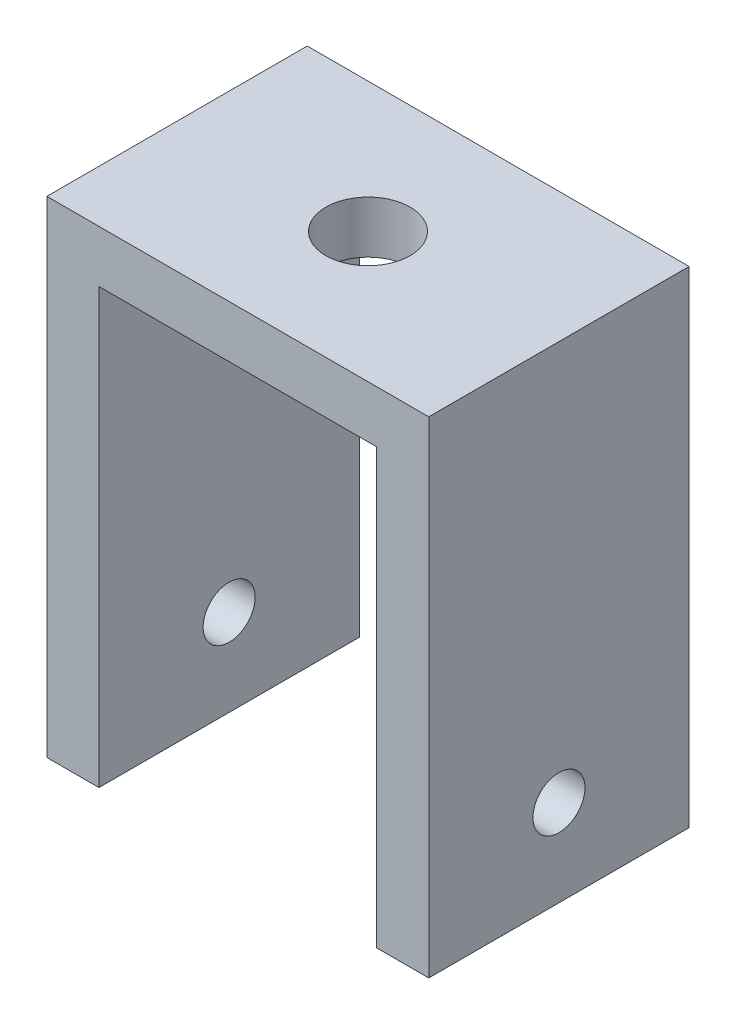
ISO-10303-21;
HEADER;
FILE_DESCRIPTION(('STEP AP214'),'2;1');
FILE_NAME('part.step','',(''),(''),'','','');
FILE_SCHEMA(('AUTOMOTIVE_DESIGN { 1 0 10303 214 1 1 1 1 }'));
ENDSEC;
DATA;
#1=APPLICATION_CONTEXT('core data for automotive mechanical design processes');
#2=APPLICATION_PROTOCOL_DEFINITION('international standard','automotive_design',2000,#1);
#3=PRODUCT_CONTEXT('',#1,'mechanical');
#4=PRODUCT('Part','Part','',(#3));
#5=PRODUCT_RELATED_PRODUCT_CATEGORY('part','',(#4));
#6=PRODUCT_DEFINITION_FORMATION('','',#4);
#7=PRODUCT_DEFINITION_CONTEXT('part definition',#1,'design');
#8=PRODUCT_DEFINITION('design','',#6,#7);
#9=PRODUCT_DEFINITION_SHAPE('','',#8);
#10=(LENGTH_UNIT() NAMED_UNIT(*) SI_UNIT(.MILLI.,.METRE.));
#11=(NAMED_UNIT(*) PLANE_ANGLE_UNIT() SI_UNIT($,.RADIAN.));
#12=(NAMED_UNIT(*) SI_UNIT($,.STERADIAN.) SOLID_ANGLE_UNIT());
#13=UNCERTAINTY_MEASURE_WITH_UNIT(LENGTH_MEASURE(1.E-05),#10,'distance_accuracy_value','');
#14=(GEOMETRIC_REPRESENTATION_CONTEXT(3) GLOBAL_UNCERTAINTY_ASSIGNED_CONTEXT((#13)) GLOBAL_UNIT_ASSIGNED_CONTEXT((#10,
#11,#12)) REPRESENTATION_CONTEXT('',''));
#15=CARTESIAN_POINT('',(0.,0.,0.));
#16=DIRECTION('',(0.,0.,1.));
#17=DIRECTION('',(1.,0.,0.));
#18=AXIS2_PLACEMENT_3D('',#15,#16,#17);
#19=CARTESIAN_POINT('',(0.,0.,15.));
#20=DIRECTION('',(0.,1.,0.));
#21=DIRECTION('',(0.,0.,1.));
#22=AXIS2_PLACEMENT_3D('',#19,#20,#21);
#23=PLANE('',#22);
#24=CARTESIAN_POINT('',(0.,0.,7.5));
#25=DIRECTION('',(0.,1.,0.));
#26=DIRECTION('',(0.,0.,1.));
#27=AXIS2_PLACEMENT_3D('',#24,#25,#26);
#28=CIRCLE('',#27,2.425);
#29=CARTESIAN_POINT('',(0.,0.,9.925));
#30=VERTEX_POINT('',#29);
#31=EDGE_CURVE('E218',#30,#30,#28,.T.);
#32=ORIENTED_EDGE('',*,*,#31,.T.);
#33=EDGE_LOOP('',(#32));
#34=FACE_BOUND('',#33,.T.);
#35=DIRECTION('',(1.,0.,0.));
#36=VECTOR('',#35,1.);
#37=CARTESIAN_POINT('',(0.,0.,0.));
#38=LINE('',#37,#36);
#39=CARTESIAN_POINT('',(-8.,0.,0.));
#40=VERTEX_POINT('',#39);
#41=CARTESIAN_POINT('',(8.,0.,0.));
#42=VERTEX_POINT('',#41);
#43=EDGE_CURVE('E93',#40,#42,#38,.T.);
#44=ORIENTED_EDGE('',*,*,#43,.T.);
#45=DIRECTION('',(0.,0.,-1.));
#46=VECTOR('',#45,1.);
#47=CARTESIAN_POINT('',(8.,0.,15.));
#48=LINE('',#47,#46);
#49=CARTESIAN_POINT('',(8.,0.,15.));
#50=VERTEX_POINT('',#49);
#51=EDGE_CURVE('E11',#50,#42,#48,.T.);
#52=ORIENTED_EDGE('',*,*,#51,.F.);
#53=DIRECTION('',(1.,0.,0.));
#54=VECTOR('',#53,1.);
#55=CARTESIAN_POINT('',(0.,0.,15.));
#56=LINE('',#55,#54);
#57=CARTESIAN_POINT('',(-8.,0.,15.));
#58=VERTEX_POINT('',#57);
#59=EDGE_CURVE('E99',#58,#50,#56,.T.);
#60=ORIENTED_EDGE('',*,*,#59,.F.);
#61=DIRECTION('',(0.,0.,-1.));
#62=VECTOR('',#61,1.);
#63=CARTESIAN_POINT('',(-8.,0.,15.));
#64=LINE('',#63,#62);
#65=EDGE_CURVE('E137',#58,#40,#64,.T.);
#66=ORIENTED_EDGE('',*,*,#65,.T.);
#67=EDGE_LOOP('',(#44,#52,#60,#66));
#68=FACE_BOUND('',#67,.T.);
#69=ADVANCED_FACE('F39',(#34,#68),#23,.F.);
#70=CARTESIAN_POINT('',(8.,0.,15.));
#71=DIRECTION('',(1.,0.,0.));
#72=DIRECTION('',(0.,1.,0.));
#73=AXIS2_PLACEMENT_3D('',#70,#71,#72);
#74=PLANE('',#73);
#75=CARTESIAN_POINT('',(8.,-20.,7.5));
#76=DIRECTION('',(1.,0.,0.));
#77=DIRECTION('',(0.,1.,0.));
#78=AXIS2_PLACEMENT_3D('',#75,#76,#77);
#79=CIRCLE('',#78,1.5);
#80=CARTESIAN_POINT('',(8.,-18.5,7.5));
#81=VERTEX_POINT('',#80);
#82=EDGE_CURVE('E144',#81,#81,#79,.T.);
#83=ORIENTED_EDGE('',*,*,#82,.T.);
#84=EDGE_LOOP('',(#83));
#85=FACE_BOUND('',#84,.T.);
#86=DIRECTION('',(0.,-1.,0.));
#87=VECTOR('',#86,1.);
#88=CARTESIAN_POINT('',(8.,0.,0.));
#89=LINE('',#88,#87);
#90=CARTESIAN_POINT('',(8.,-25.,0.));
#91=VERTEX_POINT('',#90);
#92=EDGE_CURVE('E143',#42,#91,#89,.T.);
#93=ORIENTED_EDGE('',*,*,#92,.T.);
#94=DIRECTION('',(0.,0.,-1.));
#95=VECTOR('',#94,1.);
#96=CARTESIAN_POINT('',(8.,-25.,15.));
#97=LINE('',#96,#95);
#98=CARTESIAN_POINT('',(8.,-25.,15.));
#99=VERTEX_POINT('',#98);
#100=EDGE_CURVE('E49',#99,#91,#97,.T.);
#101=ORIENTED_EDGE('',*,*,#100,.F.);
#102=DIRECTION('',(0.,-1.,0.));
#103=VECTOR('',#102,1.);
#104=CARTESIAN_POINT('',(8.,0.,15.));
#105=LINE('',#104,#103);
#106=EDGE_CURVE('E205',#50,#99,#105,.T.);
#107=ORIENTED_EDGE('',*,*,#106,.F.);
#108=ORIENTED_EDGE('',*,*,#51,.T.);
#109=EDGE_LOOP('',(#93,#101,#107,#108));
#110=FACE_BOUND('',#109,.T.);
#111=ADVANCED_FACE('F244',(#85,#110),#74,.F.);
#112=CARTESIAN_POINT('',(8.,-25.,15.));
#113=DIRECTION('',(0.,1.,0.));
#114=DIRECTION('',(0.,0.,1.));
#115=AXIS2_PLACEMENT_3D('',#112,#113,#114);
#116=PLANE('',#115);
#117=DIRECTION('',(1.,0.,0.));
#118=VECTOR('',#117,1.);
#119=CARTESIAN_POINT('',(8.,-25.,0.));
#120=LINE('',#119,#118);
#121=CARTESIAN_POINT('',(11.,-25.,0.));
#122=VERTEX_POINT('',#121);
#123=EDGE_CURVE('E147',#91,#122,#120,.T.);
#124=ORIENTED_EDGE('',*,*,#123,.T.);
#125=DIRECTION('',(0.,0.,-1.));
#126=VECTOR('',#125,1.);
#127=CARTESIAN_POINT('',(11.,-25.,15.));
#128=LINE('',#127,#126);
#129=CARTESIAN_POINT('',(11.,-25.,15.));
#130=VERTEX_POINT('',#129);
#131=EDGE_CURVE('E175',#130,#122,#128,.T.);
#132=ORIENTED_EDGE('',*,*,#131,.F.);
#133=DIRECTION('',(1.,0.,0.));
#134=VECTOR('',#133,1.);
#135=CARTESIAN_POINT('',(8.,-25.,15.));
#136=LINE('',#135,#134);
#137=EDGE_CURVE('E187',#99,#130,#136,.T.);
#138=ORIENTED_EDGE('',*,*,#137,.F.);
#139=ORIENTED_EDGE('',*,*,#100,.T.);
#140=EDGE_LOOP('',(#124,#132,#138,#139));
#141=FACE_BOUND('',#140,.T.);
#142=ADVANCED_FACE('F185',(#141),#116,.F.);
#143=CARTESIAN_POINT('',(11.,3.,15.));
#144=DIRECTION('',(-1.,0.,0.));
#145=DIRECTION('',(0.,0.,1.));
#146=AXIS2_PLACEMENT_3D('',#143,#144,#145);
#147=PLANE('',#146);
#148=CARTESIAN_POINT('',(11.,-20.,7.5));
#149=DIRECTION('',(1.,0.,0.));
#150=DIRECTION('',(0.,0.,-1.));
#151=AXIS2_PLACEMENT_3D('',#148,#149,#150);
#152=CIRCLE('',#151,1.5);
#153=CARTESIAN_POINT('',(11.,-20.,6.));
#154=VERTEX_POINT('',#153);
#155=EDGE_CURVE('E213',#154,#154,#152,.T.);
#156=ORIENTED_EDGE('',*,*,#155,.F.);
#157=EDGE_LOOP('',(#156));
#158=FACE_BOUND('',#157,.T.);
#159=DIRECTION('',(0.,1.,0.));
#160=VECTOR('',#159,1.);
#161=CARTESIAN_POINT('',(11.,3.,0.));
#162=LINE('',#161,#160);
#163=CARTESIAN_POINT('',(11.,3.,0.));
#164=VERTEX_POINT('',#163);
#165=EDGE_CURVE('E150',#122,#164,#162,.T.);
#166=ORIENTED_EDGE('',*,*,#165,.T.);
#167=DIRECTION('',(0.,0.,-1.));
#168=VECTOR('',#167,1.);
#169=CARTESIAN_POINT('',(11.,3.,15.));
#170=LINE('',#169,#168);
#171=CARTESIAN_POINT('',(11.,3.,15.));
#172=VERTEX_POINT('',#171);
#173=EDGE_CURVE('E171',#172,#164,#170,.T.);
#174=ORIENTED_EDGE('',*,*,#173,.F.);
#175=DIRECTION('',(0.,1.,0.));
#176=VECTOR('',#175,1.);
#177=CARTESIAN_POINT('',(11.,3.,15.));
#178=LINE('',#177,#176);
#179=EDGE_CURVE('E199',#130,#172,#178,.T.);
#180=ORIENTED_EDGE('',*,*,#179,.F.);
#181=ORIENTED_EDGE('',*,*,#131,.T.);
#182=EDGE_LOOP('',(#166,#174,#180,#181));
#183=FACE_BOUND('',#182,.T.);
#184=ADVANCED_FACE('F194',(#158,#183),#147,.F.);
#185=CARTESIAN_POINT('',(0.,3.,15.));
#186=DIRECTION('',(0.,-1.,0.));
#187=DIRECTION('',(0.,0.,-1.));
#188=AXIS2_PLACEMENT_3D('',#185,#186,#187);
#189=PLANE('',#188);
#190=CARTESIAN_POINT('',(0.,3.,7.5));
#191=DIRECTION('',(0.,1.,0.));
#192=DIRECTION('',(0.,0.,1.));
#193=AXIS2_PLACEMENT_3D('',#190,#191,#192);
#194=CIRCLE('',#193,2.425);
#195=CARTESIAN_POINT('',(0.,3.,9.925));
#196=VERTEX_POINT('',#195);
#197=EDGE_CURVE('E225',#196,#196,#194,.T.);
#198=ORIENTED_EDGE('',*,*,#197,.F.);
#199=EDGE_LOOP('',(#198));
#200=FACE_BOUND('',#199,.T.);
#201=DIRECTION('',(-1.,0.,0.));
#202=VECTOR('',#201,1.);
#203=CARTESIAN_POINT('',(0.,3.,0.));
#204=LINE('',#203,#202);
#205=CARTESIAN_POINT('',(-11.,3.,0.));
#206=VERTEX_POINT('',#205);
#207=EDGE_CURVE('E154',#164,#206,#204,.T.);
#208=ORIENTED_EDGE('',*,*,#207,.T.);
#209=DIRECTION('',(0.,0.,-1.));
#210=VECTOR('',#209,1.);
#211=CARTESIAN_POINT('',(-11.,3.,15.));
#212=LINE('',#211,#210);
#213=CARTESIAN_POINT('',(-11.,3.,15.));
#214=VERTEX_POINT('',#213);
#215=EDGE_CURVE('E130',#214,#206,#212,.T.);
#216=ORIENTED_EDGE('',*,*,#215,.F.);
#217=DIRECTION('',(-1.,0.,0.));
#218=VECTOR('',#217,1.);
#219=CARTESIAN_POINT('',(0.,3.,15.));
#220=LINE('',#219,#218);
#221=EDGE_CURVE('E119',#172,#214,#220,.T.);
#222=ORIENTED_EDGE('',*,*,#221,.F.);
#223=ORIENTED_EDGE('',*,*,#173,.T.);
#224=EDGE_LOOP('',(#208,#216,#222,#223));
#225=FACE_BOUND('',#224,.T.);
#226=ADVANCED_FACE('F197',(#200,#225),#189,.F.);
#227=CARTESIAN_POINT('',(-11.,3.,15.));
#228=DIRECTION('',(1.,0.,0.));
#229=DIRECTION('',(0.,1.,0.));
#230=AXIS2_PLACEMENT_3D('',#227,#228,#229);
#231=PLANE('',#230);
#232=CARTESIAN_POINT('',(-11.,-20.,7.5));
#233=DIRECTION('',(1.,0.,0.));
#234=DIRECTION('',(0.,0.,-1.));
#235=AXIS2_PLACEMENT_3D('',#232,#233,#234);
#236=CIRCLE('',#235,1.5);
#237=CARTESIAN_POINT('',(-11.,-20.,6.));
#238=VERTEX_POINT('',#237);
#239=EDGE_CURVE('E217',#238,#238,#236,.T.);
#240=ORIENTED_EDGE('',*,*,#239,.T.);
#241=EDGE_LOOP('',(#240));
#242=FACE_BOUND('',#241,.T.);
#243=DIRECTION('',(0.,-1.,0.));
#244=VECTOR('',#243,1.);
#245=CARTESIAN_POINT('',(-11.,3.,0.));
#246=LINE('',#245,#244);
#247=CARTESIAN_POINT('',(-11.,-25.,0.));
#248=VERTEX_POINT('',#247);
#249=EDGE_CURVE('E128',#206,#248,#246,.T.);
#250=ORIENTED_EDGE('',*,*,#249,.T.);
#251=DIRECTION('',(0.,0.,-1.));
#252=VECTOR('',#251,1.);
#253=CARTESIAN_POINT('',(-11.,-25.,15.));
#254=LINE('',#253,#252);
#255=CARTESIAN_POINT('',(-11.,-25.,15.));
#256=VERTEX_POINT('',#255);
#257=EDGE_CURVE('E125',#256,#248,#254,.T.);
#258=ORIENTED_EDGE('',*,*,#257,.F.);
#259=DIRECTION('',(0.,-1.,0.));
#260=VECTOR('',#259,1.);
#261=CARTESIAN_POINT('',(-11.,3.,15.));
#262=LINE('',#261,#260);
#263=EDGE_CURVE('E113',#214,#256,#262,.T.);
#264=ORIENTED_EDGE('',*,*,#263,.F.);
#265=ORIENTED_EDGE('',*,*,#215,.T.);
#266=EDGE_LOOP('',(#250,#258,#264,#265));
#267=FACE_BOUND('',#266,.T.);
#268=ADVANCED_FACE('F126',(#242,#267),#231,.F.);
#269=CARTESIAN_POINT('',(-8.,-25.,15.));
#270=DIRECTION('',(0.,1.,0.));
#271=DIRECTION('',(0.,0.,1.));
#272=AXIS2_PLACEMENT_3D('',#269,#270,#271);
#273=PLANE('',#272);
#274=DIRECTION('',(1.,0.,0.));
#275=VECTOR('',#274,1.);
#276=CARTESIAN_POINT('',(-8.,-25.,0.));
#277=LINE('',#276,#275);
#278=CARTESIAN_POINT('',(-8.,-25.,0.));
#279=VERTEX_POINT('',#278);
#280=EDGE_CURVE('E86',#248,#279,#277,.T.);
#281=ORIENTED_EDGE('',*,*,#280,.T.);
#282=DIRECTION('',(0.,0.,-1.));
#283=VECTOR('',#282,1.);
#284=CARTESIAN_POINT('',(-8.,-25.,15.));
#285=LINE('',#284,#283);
#286=CARTESIAN_POINT('',(-8.,-25.,15.));
#287=VERTEX_POINT('',#286);
#288=EDGE_CURVE('E131',#287,#279,#285,.T.);
#289=ORIENTED_EDGE('',*,*,#288,.F.);
#290=DIRECTION('',(1.,0.,0.));
#291=VECTOR('',#290,1.);
#292=CARTESIAN_POINT('',(-8.,-25.,15.));
#293=LINE('',#292,#291);
#294=EDGE_CURVE('E117',#256,#287,#293,.T.);
#295=ORIENTED_EDGE('',*,*,#294,.F.);
#296=ORIENTED_EDGE('',*,*,#257,.T.);
#297=EDGE_LOOP('',(#281,#289,#295,#296));
#298=FACE_BOUND('',#297,.T.);
#299=ADVANCED_FACE('F133',(#298),#273,.F.);
#300=CARTESIAN_POINT('',(-8.,0.,15.));
#301=DIRECTION('',(-1.,0.,0.));
#302=DIRECTION('',(0.,-1.,0.));
#303=AXIS2_PLACEMENT_3D('',#300,#301,#302);
#304=PLANE('',#303);
#305=CARTESIAN_POINT('',(-8.,-20.,7.5));
#306=DIRECTION('',(-1.,0.,0.));
#307=DIRECTION('',(0.,-1.,0.));
#308=AXIS2_PLACEMENT_3D('',#305,#306,#307);
#309=CIRCLE('',#308,1.5);
#310=CARTESIAN_POINT('',(-8.,-21.5,7.5));
#311=VERTEX_POINT('',#310);
#312=EDGE_CURVE('E42',#311,#311,#309,.T.);
#313=ORIENTED_EDGE('',*,*,#312,.T.);
#314=EDGE_LOOP('',(#313));
#315=FACE_BOUND('',#314,.T.);
#316=DIRECTION('',(0.,1.,0.));
#317=VECTOR('',#316,1.);
#318=CARTESIAN_POINT('',(-8.,0.,0.));
#319=LINE('',#318,#317);
#320=EDGE_CURVE('E161',#279,#40,#319,.T.);
#321=ORIENTED_EDGE('',*,*,#320,.T.);
#322=ORIENTED_EDGE('',*,*,#65,.F.);
#323=DIRECTION('',(0.,1.,0.));
#324=VECTOR('',#323,1.);
#325=CARTESIAN_POINT('',(-8.,0.,15.));
#326=LINE('',#325,#324);
#327=EDGE_CURVE('E57',#287,#58,#326,.T.);
#328=ORIENTED_EDGE('',*,*,#327,.F.);
#329=ORIENTED_EDGE('',*,*,#288,.T.);
#330=EDGE_LOOP('',(#321,#322,#328,#329));
#331=FACE_BOUND('',#330,.T.);
#332=ADVANCED_FACE('F253',(#315,#331),#304,.F.);
#333=CARTESIAN_POINT('',(0.,0.,15.));
#334=DIRECTION('',(0.,0.,1.));
#335=DIRECTION('',(1.,0.,0.));
#336=AXIS2_PLACEMENT_3D('',#333,#334,#335);
#337=PLANE('',#336);
#338=ORIENTED_EDGE('',*,*,#59,.T.);
#339=ORIENTED_EDGE('',*,*,#106,.T.);
#340=ORIENTED_EDGE('',*,*,#137,.T.);
#341=ORIENTED_EDGE('',*,*,#179,.T.);
#342=ORIENTED_EDGE('',*,*,#221,.T.);
#343=ORIENTED_EDGE('',*,*,#263,.T.);
#344=ORIENTED_EDGE('',*,*,#294,.T.);
#345=ORIENTED_EDGE('',*,*,#327,.T.);
#346=EDGE_LOOP('',(#338,#339,#340,#341,#342,#343,#344,#345));
#347=FACE_BOUND('',#346,.T.);
#348=ADVANCED_FACE('F115',(#347),#337,.T.);
#349=CARTESIAN_POINT('',(0.,0.,0.));
#350=DIRECTION('',(0.,0.,1.));
#351=DIRECTION('',(1.,0.,0.));
#352=AXIS2_PLACEMENT_3D('',#349,#350,#351);
#353=PLANE('',#352);
#354=ORIENTED_EDGE('',*,*,#43,.F.);
#355=ORIENTED_EDGE('',*,*,#320,.F.);
#356=ORIENTED_EDGE('',*,*,#280,.F.);
#357=ORIENTED_EDGE('',*,*,#249,.F.);
#358=ORIENTED_EDGE('',*,*,#207,.F.);
#359=ORIENTED_EDGE('',*,*,#165,.F.);
#360=ORIENTED_EDGE('',*,*,#123,.F.);
#361=ORIENTED_EDGE('',*,*,#92,.F.);
#362=EDGE_LOOP('',(#354,#355,#356,#357,#358,#359,#360,#361));
#363=FACE_BOUND('',#362,.T.);
#364=ADVANCED_FACE('F191',(#363),#353,.F.);
#365=CARTESIAN_POINT('',(-11.,-20.,7.5));
#366=DIRECTION('',(1.,0.,0.));
#367=DIRECTION('',(0.,0.,-1.));
#368=AXIS2_PLACEMENT_3D('',#365,#366,#367);
#369=CYLINDRICAL_SURFACE('',#368,1.5);
#370=ORIENTED_EDGE('',*,*,#239,.F.);
#371=EDGE_LOOP('',(#370));
#372=FACE_BOUND('',#371,.T.);
#373=ORIENTED_EDGE('',*,*,#312,.F.);
#374=EDGE_LOOP('',(#373));
#375=FACE_BOUND('',#374,.T.);
#376=ADVANCED_FACE('F266',(#372,#375),#369,.F.);
#377=ORIENTED_EDGE('',*,*,#155,.T.);
#378=EDGE_LOOP('',(#377));
#379=FACE_BOUND('',#378,.T.);
#380=ORIENTED_EDGE('',*,*,#82,.F.);
#381=EDGE_LOOP('',(#380));
#382=FACE_BOUND('',#381,.T.);
#383=ADVANCED_FACE('F268',(#379,#382),#369,.F.);
#384=CARTESIAN_POINT('',(0.,-25.,7.5));
#385=DIRECTION('',(0.,1.,0.));
#386=DIRECTION('',(0.,0.,1.));
#387=AXIS2_PLACEMENT_3D('',#384,#385,#386);
#388=CYLINDRICAL_SURFACE('',#387,2.425);
#389=ORIENTED_EDGE('',*,*,#197,.T.);
#390=EDGE_LOOP('',(#389));
#391=FACE_BOUND('',#390,.T.);
#392=ORIENTED_EDGE('',*,*,#31,.F.);
#393=EDGE_LOOP('',(#392));
#394=FACE_BOUND('',#393,.T.);
#395=ADVANCED_FACE('F230',(#391,#394),#388,.F.);
#396=CLOSED_SHELL('',(#69,#111,#142,#184,#226,#268,#299,#332,#348,#364,#376,#383,#395));
#397=MANIFOLD_SOLID_BREP('B2',#396);
#398=ADVANCED_BREP_SHAPE_REPRESENTATION('',(#18,#397),#14);
#399=SHAPE_DEFINITION_REPRESENTATION(#9,#398);
ENDSEC;
END-ISO-10303-21;
